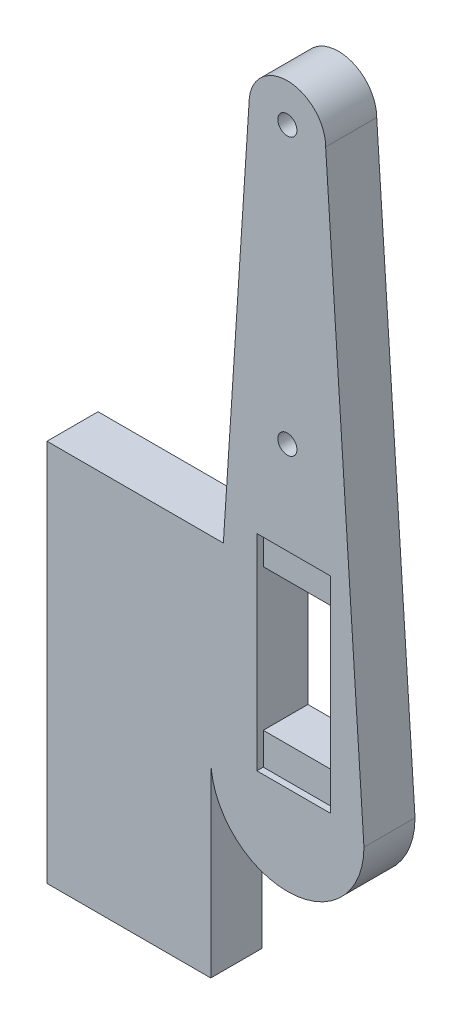
ISO-10303-21;
HEADER;
FILE_DESCRIPTION(('STEP AP214'),'2;1');
FILE_NAME('part.step','',(''),(''),'','','');
FILE_SCHEMA(('AUTOMOTIVE_DESIGN { 1 0 10303 214 1 1 1 1 }'));
ENDSEC;
DATA;
#1=APPLICATION_CONTEXT('core data for automotive mechanical design processes');
#2=APPLICATION_PROTOCOL_DEFINITION('international standard','automotive_design',2000,#1);
#3=PRODUCT_CONTEXT('',#1,'mechanical');
#4=PRODUCT('Part','Part','',(#3));
#5=PRODUCT_RELATED_PRODUCT_CATEGORY('part','',(#4));
#6=PRODUCT_DEFINITION_FORMATION('','',#4);
#7=PRODUCT_DEFINITION_CONTEXT('part definition',#1,'design');
#8=PRODUCT_DEFINITION('design','',#6,#7);
#9=PRODUCT_DEFINITION_SHAPE('','',#8);
#10=(LENGTH_UNIT() NAMED_UNIT(*) SI_UNIT(.MILLI.,.METRE.));
#11=(NAMED_UNIT(*) PLANE_ANGLE_UNIT() SI_UNIT($,.RADIAN.));
#12=(NAMED_UNIT(*) SI_UNIT($,.STERADIAN.) SOLID_ANGLE_UNIT());
#13=UNCERTAINTY_MEASURE_WITH_UNIT(LENGTH_MEASURE(1.E-05),#10,'distance_accuracy_value','');
#14=(GEOMETRIC_REPRESENTATION_CONTEXT(3) GLOBAL_UNCERTAINTY_ASSIGNED_CONTEXT((#13)) GLOBAL_UNIT_ASSIGNED_CONTEXT((#10,
#11,#12)) REPRESENTATION_CONTEXT('',''));
#15=CARTESIAN_POINT('',(0.,0.,0.));
#16=DIRECTION('',(0.,0.,1.));
#17=DIRECTION('',(1.,0.,0.));
#18=AXIS2_PLACEMENT_3D('',#15,#16,#17);
#19=CARTESIAN_POINT('',(12.8290169786709,57.8706896551724,8.));
#20=DIRECTION('',(0.,0.,1.));
#21=DIRECTION('',(1.,0.,0.));
#22=AXIS2_PLACEMENT_3D('',#19,#20,#21);
#23=PLANE('',#22);
#24=CARTESIAN_POINT('',(12.8290169786709,57.8706896551724,8.));
#25=DIRECTION('',(0.,0.,1.));
#26=DIRECTION('',(1.,0.,0.));
#27=AXIS2_PLACEMENT_3D('',#24,#25,#26);
#28=CIRCLE('',#27,1.5);
#29=CARTESIAN_POINT('',(14.3290169786709,57.8706896551724,8.));
#30=VERTEX_POINT('',#29);
#31=EDGE_CURVE('E257',#30,#30,#28,.T.);
#32=ORIENTED_EDGE('',*,*,#31,.F.);
#33=EDGE_LOOP('',(#32));
#34=FACE_BOUND('',#33,.T.);
#35=CARTESIAN_POINT('',(12.8290169786709,57.8706896551724,8.));
#36=DIRECTION('',(0.,0.,1.));
#37=DIRECTION('',(1.,0.,0.));
#38=AXIS2_PLACEMENT_3D('',#35,#36,#37);
#39=CIRCLE('',#38,6.);
#40=CARTESIAN_POINT('',(18.8290169786709,57.8706896551724,8.));
#41=VERTEX_POINT('',#40);
#42=CARTESIAN_POINT('',(6.82901697867094,57.8706896551724,8.));
#43=VERTEX_POINT('',#42);
#44=EDGE_CURVE('E265',#41,#43,#39,.T.);
#45=ORIENTED_EDGE('',*,*,#44,.T.);
#46=DIRECTION('',(-0.0650791373455968,-0.997880105965819,0.));
#47=VECTOR('',#46,1.);
#48=CARTESIAN_POINT('',(6.82901697867094,57.8706896551724,8.));
#49=LINE('',#48,#47);
#50=CARTESIAN_POINT('',(2.80240528451802,-3.87068965517243,8.));
#51=VERTEX_POINT('',#50);
#52=EDGE_CURVE('E269',#43,#51,#49,.T.);
#53=ORIENTED_EDGE('',*,*,#52,.T.);
#54=DIRECTION('',(-1.,0.,0.));
#55=VECTOR('',#54,1.);
#56=CARTESIAN_POINT('',(2.80240528451802,-3.87068965517243,8.));
#57=LINE('',#56,#55);
#58=CARTESIAN_POINT('',(-24.8290169786709,-3.87068965517242,8.));
#59=VERTEX_POINT('',#58);
#60=EDGE_CURVE('E273',#51,#59,#57,.T.);
#61=ORIENTED_EDGE('',*,*,#60,.T.);
#62=DIRECTION('',(0.,-1.,0.));
#63=VECTOR('',#62,1.);
#64=CARTESIAN_POINT('',(-24.8290169786709,-3.87068965517242,8.));
#65=LINE('',#64,#63);
#66=CARTESIAN_POINT('',(-24.8290169786709,-63.8706896551724,8.));
#67=VERTEX_POINT('',#66);
#68=EDGE_CURVE('E276',#59,#67,#65,.T.);
#69=ORIENTED_EDGE('',*,*,#68,.T.);
#70=DIRECTION('',(1.,0.,0.));
#71=VECTOR('',#70,1.);
#72=CARTESIAN_POINT('',(0.829016978670948,-63.8706896551724,8.));
#73=LINE('',#72,#71);
#74=CARTESIAN_POINT('',(0.829016978670948,-63.8706896551724,8.));
#75=VERTEX_POINT('',#74);
#76=EDGE_CURVE('E279',#67,#75,#73,.T.);
#77=ORIENTED_EDGE('',*,*,#76,.T.);
#78=DIRECTION('',(0.,1.,0.));
#79=VECTOR('',#78,1.);
#80=CARTESIAN_POINT('',(0.829016978670945,-34.1293103448276,8.));
#81=LINE('',#80,#79);
#82=CARTESIAN_POINT('',(0.829016978670934,-34.1293103448276,8.));
#83=VERTEX_POINT('',#82);
#84=EDGE_CURVE('E282',#75,#83,#81,.T.);
#85=ORIENTED_EDGE('',*,*,#84,.T.);
#86=CARTESIAN_POINT('',(12.8290169786709,-34.1293103448276,8.));
#87=DIRECTION('',(0.,0.,1.));
#88=DIRECTION('',(1.,0.,0.));
#89=AXIS2_PLACEMENT_3D('',#86,#87,#88);
#90=CIRCLE('',#89,12.);
#91=CARTESIAN_POINT('',(24.8290169786709,-34.1293103448276,8.));
#92=VERTEX_POINT('',#91);
#93=EDGE_CURVE('E285',#83,#92,#90,.T.);
#94=ORIENTED_EDGE('',*,*,#93,.T.);
#95=DIRECTION('',(-0.065079137345597,0.997880105965818,0.));
#96=VECTOR('',#95,1.);
#97=CARTESIAN_POINT('',(18.8290169786709,57.8706896551724,8.));
#98=LINE('',#97,#96);
#99=EDGE_CURVE('E288',#92,#41,#98,.T.);
#100=ORIENTED_EDGE('',*,*,#99,.T.);
#101=EDGE_LOOP('',(#45,#53,#61,#69,#77,#85,#94,#100));
#102=FACE_BOUND('',#101,.T.);
#103=CARTESIAN_POINT('',(12.8290169786709,14.5706896551724,8.));
#104=DIRECTION('',(0.,0.,1.));
#105=DIRECTION('',(1.,0.,0.));
#106=AXIS2_PLACEMENT_3D('',#103,#104,#105);
#107=CIRCLE('',#106,1.5);
#108=CARTESIAN_POINT('',(14.3290169786709,14.5706896551724,8.));
#109=VERTEX_POINT('',#108);
#110=EDGE_CURVE('E249',#109,#109,#107,.T.);
#111=ORIENTED_EDGE('',*,*,#110,.F.);
#112=EDGE_LOOP('',(#111));
#113=FACE_BOUND('',#112,.T.);
#114=DIRECTION('',(1.,0.,0.));
#115=VECTOR('',#114,1.);
#116=CARTESIAN_POINT('',(0.,-32.1493103448276,8.));
#117=LINE('',#116,#115);
#118=CARTESIAN_POINT('',(8.05240528451809,-32.1493103448276,8.));
#119=VERTEX_POINT('',#118);
#120=CARTESIAN_POINT('',(19.5524052845181,-32.1493103448276,8.));
#121=VERTEX_POINT('',#120);
#122=EDGE_CURVE('E192',#119,#121,#117,.T.);
#123=ORIENTED_EDGE('',*,*,#122,.F.);
#124=DIRECTION('',(0.,1.,0.));
#125=VECTOR('',#124,1.);
#126=CARTESIAN_POINT('',(8.05240528451802,57.8706896551724,8.));
#127=LINE('',#126,#125);
#128=CARTESIAN_POINT('',(8.05240528451799,0.0506896551724107,8.));
#129=VERTEX_POINT('',#128);
#130=EDGE_CURVE('E179',#119,#129,#127,.T.);
#131=ORIENTED_EDGE('',*,*,#130,.T.);
#132=DIRECTION('',(1.,0.,0.));
#133=VECTOR('',#132,1.);
#134=CARTESIAN_POINT('',(0.,0.0506896551724107,8.));
#135=LINE('',#134,#133);
#136=CARTESIAN_POINT('',(19.5524052845183,0.0506896551724107,8.));
#137=VERTEX_POINT('',#136);
#138=EDGE_CURVE('E205',#129,#137,#135,.T.);
#139=ORIENTED_EDGE('',*,*,#138,.T.);
#140=DIRECTION('',(0.,1.,0.));
#141=VECTOR('',#140,1.);
#142=CARTESIAN_POINT('',(19.552405284518,57.8706896551724,8.));
#143=LINE('',#142,#141);
#144=EDGE_CURVE('E245',#121,#137,#143,.T.);
#145=ORIENTED_EDGE('',*,*,#144,.F.);
#146=EDGE_LOOP('',(#123,#131,#139,#145));
#147=FACE_BOUND('',#146,.T.);
#148=ADVANCED_FACE('F58',(#34,#102,#113,#147),#23,.T.);
#149=CARTESIAN_POINT('',(0.,-4.94931034482759,8.000012));
#150=DIRECTION('',(0.,1.,0.));
#151=DIRECTION('',(0.,0.,1.));
#152=AXIS2_PLACEMENT_3D('',#149,#150,#151);
#153=PLANE('',#152);
#154=DIRECTION('',(-1.,0.,0.));
#155=VECTOR('',#154,1.);
#156=CARTESIAN_POINT('',(0.,-4.94931034482761,7.));
#157=LINE('',#156,#155);
#158=CARTESIAN_POINT('',(19.552405284518,-4.94931034482759,7.));
#159=VERTEX_POINT('',#158);
#160=CARTESIAN_POINT('',(8.05240528451801,-4.94931034482759,7.));
#161=VERTEX_POINT('',#160);
#162=EDGE_CURVE('E222',#159,#161,#157,.T.);
#163=ORIENTED_EDGE('',*,*,#162,.T.);
#164=DIRECTION('',(0.,0.,-1.));
#165=VECTOR('',#164,1.);
#166=CARTESIAN_POINT('',(8.05240528451801,-4.94931034482759,8.000012));
#167=LINE('',#166,#165);
#168=CARTESIAN_POINT('',(8.05240528451801,-4.94931034482759,0.));
#169=VERTEX_POINT('',#168);
#170=EDGE_CURVE('E237',#161,#169,#167,.T.);
#171=ORIENTED_EDGE('',*,*,#170,.T.);
#172=DIRECTION('',(-1.,0.,0.));
#173=VECTOR('',#172,1.);
#174=CARTESIAN_POINT('',(12.8290169786709,-4.94931034482758,0.));
#175=LINE('',#174,#173);
#176=CARTESIAN_POINT('',(19.552405284518,-4.94931034482759,0.));
#177=VERTEX_POINT('',#176);
#178=EDGE_CURVE('E67',#177,#169,#175,.T.);
#179=ORIENTED_EDGE('',*,*,#178,.F.);
#180=DIRECTION('',(0.,0.,-1.));
#181=VECTOR('',#180,1.);
#182=CARTESIAN_POINT('',(19.552405284518,-4.94931034482759,8.000012));
#183=LINE('',#182,#181);
#184=EDGE_CURVE('E240',#159,#177,#183,.T.);
#185=ORIENTED_EDGE('',*,*,#184,.F.);
#186=EDGE_LOOP('',(#163,#171,#179,#185));
#187=FACE_BOUND('',#186,.T.);
#188=ADVANCED_FACE('F362',(#187),#153,.F.);
#189=CARTESIAN_POINT('',(0.,-27.1493103448276,8.000012));
#190=DIRECTION('',(0.,-1.,0.));
#191=DIRECTION('',(0.,0.,-1.));
#192=AXIS2_PLACEMENT_3D('',#189,#190,#191);
#193=PLANE('',#192);
#194=DIRECTION('',(-1.,0.,0.));
#195=VECTOR('',#194,1.);
#196=CARTESIAN_POINT('',(0.,-27.1493103448276,7.));
#197=LINE('',#196,#195);
#198=CARTESIAN_POINT('',(19.552405284518,-27.1493103448276,7.));
#199=VERTEX_POINT('',#198);
#200=CARTESIAN_POINT('',(8.05240528451802,-27.1493103448276,7.));
#201=VERTEX_POINT('',#200);
#202=EDGE_CURVE('E186',#199,#201,#197,.T.);
#203=ORIENTED_EDGE('',*,*,#202,.F.);
#204=DIRECTION('',(0.,0.,-1.));
#205=VECTOR('',#204,1.);
#206=CARTESIAN_POINT('',(19.552405284518,-27.1493103448276,8.000012));
#207=LINE('',#206,#205);
#208=CARTESIAN_POINT('',(19.552405284518,-27.1493103448276,0.));
#209=VERTEX_POINT('',#208);
#210=EDGE_CURVE('E81',#199,#209,#207,.T.);
#211=ORIENTED_EDGE('',*,*,#210,.T.);
#212=DIRECTION('',(1.,0.,0.));
#213=VECTOR('',#212,1.);
#214=CARTESIAN_POINT('',(12.8290169786709,-27.1493103448276,0.));
#215=LINE('',#214,#213);
#216=CARTESIAN_POINT('',(8.05240528451802,-27.1493103448276,0.));
#217=VERTEX_POINT('',#216);
#218=EDGE_CURVE('E346',#217,#209,#215,.T.);
#219=ORIENTED_EDGE('',*,*,#218,.F.);
#220=DIRECTION('',(0.,0.,-1.));
#221=VECTOR('',#220,1.);
#222=CARTESIAN_POINT('',(8.05240528451802,-27.1493103448276,8.000012));
#223=LINE('',#222,#221);
#224=EDGE_CURVE('E234',#201,#217,#223,.T.);
#225=ORIENTED_EDGE('',*,*,#224,.F.);
#226=EDGE_LOOP('',(#203,#211,#219,#225));
#227=FACE_BOUND('',#226,.T.);
#228=ADVANCED_FACE('F366',(#227),#193,.F.);
#229=CARTESIAN_POINT('',(12.8290169786709,57.8706896551724,0.));
#230=DIRECTION('',(0.,0.,1.));
#231=DIRECTION('',(1.,0.,0.));
#232=AXIS2_PLACEMENT_3D('',#229,#230,#231);
#233=PLANE('',#232);
#234=ORIENTED_EDGE('',*,*,#218,.T.);
#235=DIRECTION('',(0.,1.,0.));
#236=VECTOR('',#235,1.);
#237=CARTESIAN_POINT('',(19.552405284518,57.8706896551724,0.));
#238=LINE('',#237,#236);
#239=EDGE_CURVE('E12',#209,#177,#238,.T.);
#240=ORIENTED_EDGE('',*,*,#239,.T.);
#241=ORIENTED_EDGE('',*,*,#178,.T.);
#242=DIRECTION('',(0.,1.,0.));
#243=VECTOR('',#242,1.);
#244=CARTESIAN_POINT('',(8.05240528451802,57.8706896551724,0.));
#245=LINE('',#244,#243);
#246=EDGE_CURVE('E350',#217,#169,#245,.T.);
#247=ORIENTED_EDGE('',*,*,#246,.F.);
#248=EDGE_LOOP('',(#234,#240,#241,#247));
#249=FACE_BOUND('',#248,.T.);
#250=CARTESIAN_POINT('',(12.8290169786709,57.8706896551724,0.));
#251=DIRECTION('',(0.,0.,1.));
#252=DIRECTION('',(1.,0.,0.));
#253=AXIS2_PLACEMENT_3D('',#250,#251,#252);
#254=CIRCLE('',#253,6.);
#255=CARTESIAN_POINT('',(18.8290169786709,57.8706896551724,0.));
#256=VERTEX_POINT('',#255);
#257=CARTESIAN_POINT('',(6.82901697867094,57.8706896551724,0.));
#258=VERTEX_POINT('',#257);
#259=EDGE_CURVE('E261',#256,#258,#254,.T.);
#260=ORIENTED_EDGE('',*,*,#259,.F.);
#261=DIRECTION('',(-0.065079137345597,0.997880105965818,0.));
#262=VECTOR('',#261,1.);
#263=CARTESIAN_POINT('',(18.8290169786709,57.8706896551724,0.));
#264=LINE('',#263,#262);
#265=CARTESIAN_POINT('',(24.8290169786709,-34.1293103448276,0.));
#266=VERTEX_POINT('',#265);
#267=EDGE_CURVE('E270',#266,#256,#264,.T.);
#268=ORIENTED_EDGE('',*,*,#267,.F.);
#269=CARTESIAN_POINT('',(12.8290169786709,-34.1293103448276,0.));
#270=DIRECTION('',(0.,0.,1.));
#271=DIRECTION('',(1.,0.,0.));
#272=AXIS2_PLACEMENT_3D('',#269,#270,#271);
#273=CIRCLE('',#272,12.);
#274=CARTESIAN_POINT('',(0.829016978670934,-34.1293103448276,0.));
#275=VERTEX_POINT('',#274);
#276=EDGE_CURVE('E310',#275,#266,#273,.T.);
#277=ORIENTED_EDGE('',*,*,#276,.F.);
#278=DIRECTION('',(0.,1.,0.));
#279=VECTOR('',#278,1.);
#280=CARTESIAN_POINT('',(0.829016978670945,-34.1293103448276,0.));
#281=LINE('',#280,#279);
#282=CARTESIAN_POINT('',(0.829016978670948,-63.8706896551724,0.));
#283=VERTEX_POINT('',#282);
#284=EDGE_CURVE('E307',#283,#275,#281,.T.);
#285=ORIENTED_EDGE('',*,*,#284,.F.);
#286=DIRECTION('',(1.,0.,0.));
#287=VECTOR('',#286,1.);
#288=CARTESIAN_POINT('',(0.829016978670948,-63.8706896551724,0.));
#289=LINE('',#288,#287);
#290=CARTESIAN_POINT('',(-24.8290169786709,-63.8706896551724,0.));
#291=VERTEX_POINT('',#290);
#292=EDGE_CURVE('E304',#291,#283,#289,.T.);
#293=ORIENTED_EDGE('',*,*,#292,.F.);
#294=DIRECTION('',(0.,-1.,0.));
#295=VECTOR('',#294,1.);
#296=CARTESIAN_POINT('',(-24.8290169786709,-3.87068965517242,0.));
#297=LINE('',#296,#295);
#298=CARTESIAN_POINT('',(-24.8290169786709,-3.87068965517242,0.));
#299=VERTEX_POINT('',#298);
#300=EDGE_CURVE('E301',#299,#291,#297,.T.);
#301=ORIENTED_EDGE('',*,*,#300,.F.);
#302=DIRECTION('',(-1.,0.,0.));
#303=VECTOR('',#302,1.);
#304=CARTESIAN_POINT('',(2.80240528451802,-3.87068965517243,0.));
#305=LINE('',#304,#303);
#306=CARTESIAN_POINT('',(2.80240528451802,-3.87068965517243,0.));
#307=VERTEX_POINT('',#306);
#308=EDGE_CURVE('E298',#307,#299,#305,.T.);
#309=ORIENTED_EDGE('',*,*,#308,.F.);
#310=DIRECTION('',(-0.0650791373455968,-0.997880105965819,0.));
#311=VECTOR('',#310,1.);
#312=CARTESIAN_POINT('',(6.82901697867094,57.8706896551724,0.));
#313=LINE('',#312,#311);
#314=EDGE_CURVE('E295',#258,#307,#313,.T.);
#315=ORIENTED_EDGE('',*,*,#314,.F.);
#316=EDGE_LOOP('',(#260,#268,#277,#285,#293,#301,#309,#315));
#317=FACE_BOUND('',#316,.T.);
#318=CARTESIAN_POINT('',(12.8290169786709,57.8706896551724,0.));
#319=DIRECTION('',(0.,0.,1.));
#320=DIRECTION('',(1.,0.,0.));
#321=AXIS2_PLACEMENT_3D('',#318,#319,#320);
#322=CIRCLE('',#321,1.5);
#323=CARTESIAN_POINT('',(14.3290169786709,57.8706896551724,0.));
#324=VERTEX_POINT('',#323);
#325=EDGE_CURVE('E253',#324,#324,#322,.T.);
#326=ORIENTED_EDGE('',*,*,#325,.T.);
#327=EDGE_LOOP('',(#326));
#328=FACE_BOUND('',#327,.T.);
#329=CARTESIAN_POINT('',(12.8290169786709,14.5706896551724,0.));
#330=DIRECTION('',(0.,0.,1.));
#331=DIRECTION('',(1.,0.,0.));
#332=AXIS2_PLACEMENT_3D('',#329,#330,#331);
#333=CIRCLE('',#332,1.5);
#334=CARTESIAN_POINT('',(14.3290169786709,14.5706896551724,0.));
#335=VERTEX_POINT('',#334);
#336=EDGE_CURVE('E248',#335,#335,#333,.T.);
#337=ORIENTED_EDGE('',*,*,#336,.T.);
#338=EDGE_LOOP('',(#337));
#339=FACE_BOUND('',#338,.T.);
#340=ADVANCED_FACE('F358',(#249,#317,#328,#339),#233,.F.);
#341=CARTESIAN_POINT('',(12.8290169786709,57.8706896551724,8.));
#342=DIRECTION('',(0.,0.,-1.));
#343=DIRECTION('',(-1.,0.,0.));
#344=AXIS2_PLACEMENT_3D('',#341,#342,#343);
#345=CYLINDRICAL_SURFACE('',#344,6.);
#346=ORIENTED_EDGE('',*,*,#259,.T.);
#347=DIRECTION('',(0.,0.,-1.));
#348=VECTOR('',#347,1.);
#349=CARTESIAN_POINT('',(6.82901697867094,57.8706896551724,8.));
#350=LINE('',#349,#348);
#351=EDGE_CURVE('E342',#43,#258,#350,.T.);
#352=ORIENTED_EDGE('',*,*,#351,.F.);
#353=ORIENTED_EDGE('',*,*,#44,.F.);
#354=DIRECTION('',(0.,0.,-1.));
#355=VECTOR('',#354,1.);
#356=CARTESIAN_POINT('',(18.8290169786709,57.8706896551724,8.));
#357=LINE('',#356,#355);
#358=EDGE_CURVE('E291',#41,#256,#357,.T.);
#359=ORIENTED_EDGE('',*,*,#358,.T.);
#360=EDGE_LOOP('',(#346,#352,#353,#359));
#361=FACE_BOUND('',#360,.T.);
#362=ADVANCED_FACE('F60',(#361),#345,.T.);
#363=CARTESIAN_POINT('',(6.82901697867094,57.8706896551724,8.));
#364=DIRECTION('',(0.997880105965818,-0.0650791373455968,0.));
#365=DIRECTION('',(0.0650791373455968,0.997880105965818,0.));
#366=AXIS2_PLACEMENT_3D('',#363,#364,#365);
#367=PLANE('',#366);
#368=ORIENTED_EDGE('',*,*,#314,.T.);
#369=DIRECTION('',(0.,0.,-1.));
#370=VECTOR('',#369,1.);
#371=CARTESIAN_POINT('',(2.80240528451802,-3.87068965517243,8.));
#372=LINE('',#371,#370);
#373=EDGE_CURVE('E338',#51,#307,#372,.T.);
#374=ORIENTED_EDGE('',*,*,#373,.F.);
#375=ORIENTED_EDGE('',*,*,#52,.F.);
#376=ORIENTED_EDGE('',*,*,#351,.T.);
#377=EDGE_LOOP('',(#368,#374,#375,#376));
#378=FACE_BOUND('',#377,.T.);
#379=ADVANCED_FACE('F410',(#378),#367,.F.);
#380=CARTESIAN_POINT('',(2.80240528451802,-3.87068965517243,8.));
#381=DIRECTION('',(0.,-1.,0.));
#382=DIRECTION('',(1.,0.,0.));
#383=AXIS2_PLACEMENT_3D('',#380,#381,#382);
#384=PLANE('',#383);
#385=ORIENTED_EDGE('',*,*,#308,.T.);
#386=DIRECTION('',(0.,0.,-1.));
#387=VECTOR('',#386,1.);
#388=CARTESIAN_POINT('',(-24.8290169786709,-3.87068965517242,8.));
#389=LINE('',#388,#387);
#390=EDGE_CURVE('E334',#59,#299,#389,.T.);
#391=ORIENTED_EDGE('',*,*,#390,.F.);
#392=ORIENTED_EDGE('',*,*,#60,.F.);
#393=ORIENTED_EDGE('',*,*,#373,.T.);
#394=EDGE_LOOP('',(#385,#391,#392,#393));
#395=FACE_BOUND('',#394,.T.);
#396=ADVANCED_FACE('F407',(#395),#384,.F.);
#397=CARTESIAN_POINT('',(-24.8290169786709,-3.87068965517242,8.));
#398=DIRECTION('',(1.,0.,0.));
#399=DIRECTION('',(0.,1.,0.));
#400=AXIS2_PLACEMENT_3D('',#397,#398,#399);
#401=PLANE('',#400);
#402=ORIENTED_EDGE('',*,*,#300,.T.);
#403=DIRECTION('',(0.,0.,-1.));
#404=VECTOR('',#403,1.);
#405=CARTESIAN_POINT('',(-24.8290169786709,-63.8706896551724,8.));
#406=LINE('',#405,#404);
#407=EDGE_CURVE('E330',#67,#291,#406,.T.);
#408=ORIENTED_EDGE('',*,*,#407,.F.);
#409=ORIENTED_EDGE('',*,*,#68,.F.);
#410=ORIENTED_EDGE('',*,*,#390,.T.);
#411=EDGE_LOOP('',(#402,#408,#409,#410));
#412=FACE_BOUND('',#411,.T.);
#413=ADVANCED_FACE('F403',(#412),#401,.F.);
#414=CARTESIAN_POINT('',(0.829016978670948,-63.8706896551724,8.));
#415=DIRECTION('',(0.,1.,0.));
#416=DIRECTION('',(0.,0.,1.));
#417=AXIS2_PLACEMENT_3D('',#414,#415,#416);
#418=PLANE('',#417);
#419=ORIENTED_EDGE('',*,*,#292,.T.);
#420=DIRECTION('',(0.,0.,-1.));
#421=VECTOR('',#420,1.);
#422=CARTESIAN_POINT('',(0.829016978670948,-63.8706896551724,8.));
#423=LINE('',#422,#421);
#424=EDGE_CURVE('E326',#75,#283,#423,.T.);
#425=ORIENTED_EDGE('',*,*,#424,.F.);
#426=ORIENTED_EDGE('',*,*,#76,.F.);
#427=ORIENTED_EDGE('',*,*,#407,.T.);
#428=EDGE_LOOP('',(#419,#425,#426,#427));
#429=FACE_BOUND('',#428,.T.);
#430=ADVANCED_FACE('F399',(#429),#418,.F.);
#431=CARTESIAN_POINT('',(0.829016978670945,-34.1293103448276,8.));
#432=DIRECTION('',(-1.,0.,0.));
#433=DIRECTION('',(0.,-1.,0.));
#434=AXIS2_PLACEMENT_3D('',#431,#432,#433);
#435=PLANE('',#434);
#436=ORIENTED_EDGE('',*,*,#284,.T.);
#437=DIRECTION('',(0.,0.,-1.));
#438=VECTOR('',#437,1.);
#439=CARTESIAN_POINT('',(0.829016978670934,-34.1293103448276,8.));
#440=LINE('',#439,#438);
#441=EDGE_CURVE('E322',#83,#275,#440,.T.);
#442=ORIENTED_EDGE('',*,*,#441,.F.);
#443=ORIENTED_EDGE('',*,*,#84,.F.);
#444=ORIENTED_EDGE('',*,*,#424,.T.);
#445=EDGE_LOOP('',(#436,#442,#443,#444));
#446=FACE_BOUND('',#445,.T.);
#447=ADVANCED_FACE('F395',(#446),#435,.F.);
#448=CARTESIAN_POINT('',(12.8290169786709,-34.1293103448276,8.));
#449=DIRECTION('',(0.,0.,-1.));
#450=DIRECTION('',(-1.,0.,0.));
#451=AXIS2_PLACEMENT_3D('',#448,#449,#450);
#452=CYLINDRICAL_SURFACE('',#451,12.);
#453=ORIENTED_EDGE('',*,*,#276,.T.);
#454=DIRECTION('',(0.,0.,-1.));
#455=VECTOR('',#454,1.);
#456=CARTESIAN_POINT('',(24.8290169786709,-34.1293103448276,8.));
#457=LINE('',#456,#455);
#458=EDGE_CURVE('E318',#92,#266,#457,.T.);
#459=ORIENTED_EDGE('',*,*,#458,.F.);
#460=ORIENTED_EDGE('',*,*,#93,.F.);
#461=ORIENTED_EDGE('',*,*,#441,.T.);
#462=EDGE_LOOP('',(#453,#459,#460,#461));
#463=FACE_BOUND('',#462,.T.);
#464=ADVANCED_FACE('F391',(#463),#452,.T.);
#465=CARTESIAN_POINT('',(18.8290169786709,57.8706896551724,8.));
#466=DIRECTION('',(-0.997880105965818,-0.065079137345597,0.));
#467=DIRECTION('',(0.065079137345597,-0.997880105965818,0.));
#468=AXIS2_PLACEMENT_3D('',#465,#466,#467);
#469=PLANE('',#468);
#470=ORIENTED_EDGE('',*,*,#267,.T.);
#471=ORIENTED_EDGE('',*,*,#358,.F.);
#472=ORIENTED_EDGE('',*,*,#99,.F.);
#473=ORIENTED_EDGE('',*,*,#458,.T.);
#474=EDGE_LOOP('',(#470,#471,#472,#473));
#475=FACE_BOUND('',#474,.T.);
#476=ADVANCED_FACE('F388',(#475),#469,.F.);
#477=CARTESIAN_POINT('',(12.8290169786709,57.8706896551724,8.));
#478=DIRECTION('',(0.,0.,-1.));
#479=DIRECTION('',(-1.,0.,0.));
#480=AXIS2_PLACEMENT_3D('',#477,#478,#479);
#481=CYLINDRICAL_SURFACE('',#480,1.5);
#482=ORIENTED_EDGE('',*,*,#31,.T.);
#483=EDGE_LOOP('',(#482));
#484=FACE_BOUND('',#483,.T.);
#485=ORIENTED_EDGE('',*,*,#325,.F.);
#486=EDGE_LOOP('',(#485));
#487=FACE_BOUND('',#486,.T.);
#488=ADVANCED_FACE('F385',(#484,#487),#481,.F.);
#489=CARTESIAN_POINT('',(12.8290169786709,14.5706896551724,8.));
#490=DIRECTION('',(0.,0.,-1.));
#491=DIRECTION('',(-1.,0.,0.));
#492=AXIS2_PLACEMENT_3D('',#489,#490,#491);
#493=CYLINDRICAL_SURFACE('',#492,1.5);
#494=ORIENTED_EDGE('',*,*,#110,.T.);
#495=EDGE_LOOP('',(#494));
#496=FACE_BOUND('',#495,.T.);
#497=ORIENTED_EDGE('',*,*,#336,.F.);
#498=EDGE_LOOP('',(#497));
#499=FACE_BOUND('',#498,.T.);
#500=ADVANCED_FACE('F468',(#496,#499),#493,.F.);
#501=CARTESIAN_POINT('',(19.552405284518,0.,8.000012));
#502=DIRECTION('',(1.,0.,0.));
#503=DIRECTION('',(0.,0.,-1.));
#504=AXIS2_PLACEMENT_3D('',#501,#502,#503);
#505=PLANE('',#504);
#506=ORIENTED_EDGE('',*,*,#144,.T.);
#507=DIRECTION('',(0.,0.,1.));
#508=VECTOR('',#507,1.);
#509=CARTESIAN_POINT('',(19.5524052845183,0.0506896551724107,7.));
#510=LINE('',#509,#508);
#511=CARTESIAN_POINT('',(19.5524052845183,0.0506896551724107,7.));
#512=VERTEX_POINT('',#511);
#513=EDGE_CURVE('E212',#512,#137,#510,.T.);
#514=ORIENTED_EDGE('',*,*,#513,.F.);
#515=DIRECTION('',(0.,-1.,0.));
#516=VECTOR('',#515,1.);
#517=CARTESIAN_POINT('',(19.5524052845183,0.,7.));
#518=LINE('',#517,#516);
#519=EDGE_CURVE('E211',#512,#159,#518,.T.);
#520=ORIENTED_EDGE('',*,*,#519,.T.);
#521=ORIENTED_EDGE('',*,*,#184,.T.);
#522=ORIENTED_EDGE('',*,*,#239,.F.);
#523=ORIENTED_EDGE('',*,*,#210,.F.);
#524=DIRECTION('',(0.,1.,0.));
#525=VECTOR('',#524,1.);
#526=CARTESIAN_POINT('',(19.5524052845181,0.,7.));
#527=LINE('',#526,#525);
#528=CARTESIAN_POINT('',(19.5524052845181,-32.1493103448276,7.));
#529=VERTEX_POINT('',#528);
#530=EDGE_CURVE('E74',#529,#199,#527,.T.);
#531=ORIENTED_EDGE('',*,*,#530,.F.);
#532=DIRECTION('',(0.,0.,1.));
#533=VECTOR('',#532,1.);
#534=CARTESIAN_POINT('',(19.5524052845181,-32.1493103448276,7.));
#535=LINE('',#534,#533);
#536=EDGE_CURVE('E185',#529,#121,#535,.T.);
#537=ORIENTED_EDGE('',*,*,#536,.T.);
#538=EDGE_LOOP('',(#506,#514,#520,#521,#522,#523,#531,#537));
#539=FACE_BOUND('',#538,.T.);
#540=ADVANCED_FACE('F447',(#539),#505,.F.);
#541=CARTESIAN_POINT('',(8.05240528451802,0.,8.000012));
#542=DIRECTION('',(1.,0.,0.));
#543=DIRECTION('',(0.,0.,-1.));
#544=AXIS2_PLACEMENT_3D('',#541,#542,#543);
#545=PLANE('',#544);
#546=ORIENTED_EDGE('',*,*,#130,.F.);
#547=DIRECTION('',(0.,0.,1.));
#548=VECTOR('',#547,1.);
#549=CARTESIAN_POINT('',(8.05240528451809,-32.1493103448276,7.));
#550=LINE('',#549,#548);
#551=CARTESIAN_POINT('',(8.05240528451809,-32.1493103448276,7.));
#552=VERTEX_POINT('',#551);
#553=EDGE_CURVE('E174',#552,#119,#550,.T.);
#554=ORIENTED_EDGE('',*,*,#553,.F.);
#555=DIRECTION('',(0.,1.,0.));
#556=VECTOR('',#555,1.);
#557=CARTESIAN_POINT('',(8.05240528451809,0.,7.));
#558=LINE('',#557,#556);
#559=EDGE_CURVE('E177',#552,#201,#558,.T.);
#560=ORIENTED_EDGE('',*,*,#559,.T.);
#561=ORIENTED_EDGE('',*,*,#224,.T.);
#562=ORIENTED_EDGE('',*,*,#246,.T.);
#563=ORIENTED_EDGE('',*,*,#170,.F.);
#564=DIRECTION('',(0.,-1.,0.));
#565=VECTOR('',#564,1.);
#566=CARTESIAN_POINT('',(8.05240528451799,0.,7.));
#567=LINE('',#566,#565);
#568=CARTESIAN_POINT('',(8.05240528451799,0.0506896551724107,7.));
#569=VERTEX_POINT('',#568);
#570=EDGE_CURVE('E226',#569,#161,#567,.T.);
#571=ORIENTED_EDGE('',*,*,#570,.F.);
#572=DIRECTION('',(0.,0.,1.));
#573=VECTOR('',#572,1.);
#574=CARTESIAN_POINT('',(8.05240528451799,0.0506896551724107,7.));
#575=LINE('',#574,#573);
#576=EDGE_CURVE('E208',#569,#129,#575,.T.);
#577=ORIENTED_EDGE('',*,*,#576,.T.);
#578=EDGE_LOOP('',(#546,#554,#560,#561,#562,#563,#571,#577));
#579=FACE_BOUND('',#578,.T.);
#580=ADVANCED_FACE('F176',(#579),#545,.T.);
#581=CARTESIAN_POINT('',(0.,-32.1493103448276,7.));
#582=DIRECTION('',(0.,-1.,0.));
#583=DIRECTION('',(0.,0.,-1.));
#584=AXIS2_PLACEMENT_3D('',#581,#582,#583);
#585=PLANE('',#584);
#586=ORIENTED_EDGE('',*,*,#122,.T.);
#587=ORIENTED_EDGE('',*,*,#536,.F.);
#588=DIRECTION('',(1.,0.,0.));
#589=VECTOR('',#588,1.);
#590=CARTESIAN_POINT('',(0.,-32.1493103448276,7.));
#591=LINE('',#590,#589);
#592=EDGE_CURVE('E189',#552,#529,#591,.T.);
#593=ORIENTED_EDGE('',*,*,#592,.F.);
#594=ORIENTED_EDGE('',*,*,#553,.T.);
#595=EDGE_LOOP('',(#586,#587,#593,#594));
#596=FACE_BOUND('',#595,.T.);
#597=ADVANCED_FACE('F194',(#596),#585,.F.);
#598=CARTESIAN_POINT('',(0.,0.,7.));
#599=DIRECTION('',(0.,0.,1.));
#600=DIRECTION('',(1.,0.,0.));
#601=AXIS2_PLACEMENT_3D('',#598,#599,#600);
#602=PLANE('',#601);
#603=ORIENTED_EDGE('',*,*,#559,.F.);
#604=ORIENTED_EDGE('',*,*,#592,.T.);
#605=ORIENTED_EDGE('',*,*,#530,.T.);
#606=ORIENTED_EDGE('',*,*,#202,.T.);
#607=EDGE_LOOP('',(#603,#604,#605,#606));
#608=FACE_BOUND('',#607,.T.);
#609=ADVANCED_FACE('F188',(#608),#602,.T.);
#610=CARTESIAN_POINT('',(0.,0.0506896551724107,7.));
#611=DIRECTION('',(0.,-1.,0.));
#612=DIRECTION('',(0.,0.,-1.));
#613=AXIS2_PLACEMENT_3D('',#610,#611,#612);
#614=PLANE('',#613);
#615=ORIENTED_EDGE('',*,*,#138,.F.);
#616=ORIENTED_EDGE('',*,*,#576,.F.);
#617=DIRECTION('',(1.,0.,0.));
#618=VECTOR('',#617,1.);
#619=CARTESIAN_POINT('',(0.,0.0506896551724107,7.));
#620=LINE('',#619,#618);
#621=EDGE_CURVE('E219',#569,#512,#620,.T.);
#622=ORIENTED_EDGE('',*,*,#621,.T.);
#623=ORIENTED_EDGE('',*,*,#513,.T.);
#624=EDGE_LOOP('',(#615,#616,#622,#623));
#625=FACE_BOUND('',#624,.T.);
#626=ADVANCED_FACE('F452',(#625),#614,.T.);
#627=CARTESIAN_POINT('',(0.,0.,7.));
#628=DIRECTION('',(0.,0.,1.));
#629=DIRECTION('',(1.,0.,0.));
#630=AXIS2_PLACEMENT_3D('',#627,#628,#629);
#631=PLANE('',#630);
#632=ORIENTED_EDGE('',*,*,#621,.F.);
#633=ORIENTED_EDGE('',*,*,#570,.T.);
#634=ORIENTED_EDGE('',*,*,#162,.F.);
#635=ORIENTED_EDGE('',*,*,#519,.F.);
#636=EDGE_LOOP('',(#632,#633,#634,#635));
#637=FACE_BOUND('',#636,.T.);
#638=ADVANCED_FACE('F450',(#637),#631,.T.);
#639=CLOSED_SHELL('',(#148,#188,#228,#340,#362,#379,#396,#413,#430,#447,#464,#476,#488,#500,
#540,#580,#597,#609,#626,#638));
#640=MANIFOLD_SOLID_BREP('B2',#639);
#641=ADVANCED_BREP_SHAPE_REPRESENTATION('',(#18,#640),#14);
#642=SHAPE_DEFINITION_REPRESENTATION(#9,#641);
ENDSEC;
END-ISO-10303-21;
